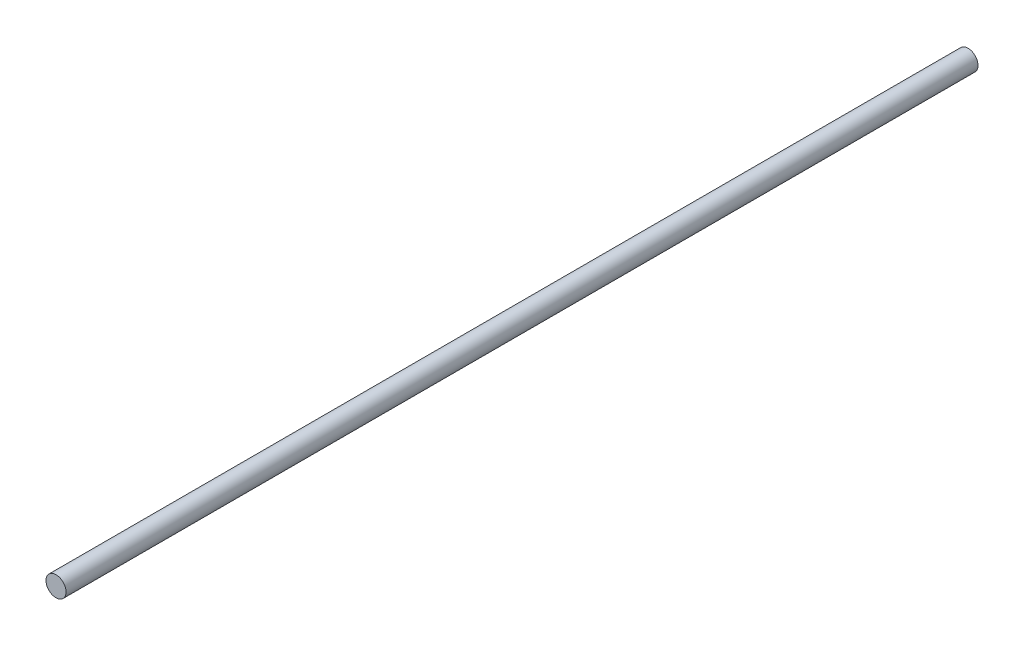
ISO-10303-21;
HEADER;
FILE_DESCRIPTION(('STEP AP214'),'2;1');
FILE_NAME('part.step','',(''),(''),'','','');
FILE_SCHEMA(('AUTOMOTIVE_DESIGN { 1 0 10303 214 1 1 1 1 }'));
ENDSEC;
DATA;
#1=APPLICATION_CONTEXT('core data for automotive mechanical design processes');
#2=APPLICATION_PROTOCOL_DEFINITION('international standard','automotive_design',2000,#1);
#3=PRODUCT_CONTEXT('',#1,'mechanical');
#4=PRODUCT('Part','Part','',(#3));
#5=PRODUCT_RELATED_PRODUCT_CATEGORY('part','',(#4));
#6=PRODUCT_DEFINITION_FORMATION('','',#4);
#7=PRODUCT_DEFINITION_CONTEXT('part definition',#1,'design');
#8=PRODUCT_DEFINITION('design','',#6,#7);
#9=PRODUCT_DEFINITION_SHAPE('','',#8);
#10=(LENGTH_UNIT() NAMED_UNIT(*) SI_UNIT(.MILLI.,.METRE.));
#11=(NAMED_UNIT(*) PLANE_ANGLE_UNIT() SI_UNIT($,.RADIAN.));
#12=(NAMED_UNIT(*) SI_UNIT($,.STERADIAN.) SOLID_ANGLE_UNIT());
#13=UNCERTAINTY_MEASURE_WITH_UNIT(LENGTH_MEASURE(1.E-05),#10,'distance_accuracy_value','');
#14=(GEOMETRIC_REPRESENTATION_CONTEXT(3) GLOBAL_UNCERTAINTY_ASSIGNED_CONTEXT((#13)) GLOBAL_UNIT_ASSIGNED_CONTEXT((#10,
#11,#12)) REPRESENTATION_CONTEXT('',''));
#15=CARTESIAN_POINT('',(0.,0.,0.));
#16=DIRECTION('',(0.,0.,1.));
#17=DIRECTION('',(1.,0.,0.));
#18=AXIS2_PLACEMENT_3D('',#15,#16,#17);
#19=CARTESIAN_POINT('',(0.,0.,273.));
#20=DIRECTION('',(0.,0.,-1.));
#21=DIRECTION('',(-1.,0.,0.));
#22=AXIS2_PLACEMENT_3D('',#19,#20,#21);
#23=CYLINDRICAL_SURFACE('',#22,3.);
#24=CARTESIAN_POINT('',(0.,0.,273.));
#25=DIRECTION('',(0.,0.,1.));
#26=DIRECTION('',(1.,0.,0.));
#27=AXIS2_PLACEMENT_3D('',#24,#25,#26);
#28=CIRCLE('',#27,3.);
#29=CARTESIAN_POINT('',(3.,0.,273.));
#30=VERTEX_POINT('',#29);
#31=EDGE_CURVE('E10',#30,#30,#28,.T.);
#32=ORIENTED_EDGE('',*,*,#31,.F.);
#33=EDGE_LOOP('',(#32));
#34=FACE_BOUND('',#33,.T.);
#35=CARTESIAN_POINT('',(0.,0.,0.));
#36=DIRECTION('',(0.,0.,1.));
#37=DIRECTION('',(1.,0.,0.));
#38=AXIS2_PLACEMENT_3D('',#35,#36,#37);
#39=CIRCLE('',#38,3.);
#40=CARTESIAN_POINT('',(3.,0.,0.));
#41=VERTEX_POINT('',#40);
#42=EDGE_CURVE('E31',#41,#41,#39,.T.);
#43=ORIENTED_EDGE('',*,*,#42,.T.);
#44=EDGE_LOOP('',(#43));
#45=FACE_BOUND('',#44,.T.);
#46=ADVANCED_FACE('F28',(#34,#45),#23,.T.);
#47=CARTESIAN_POINT('',(0.,0.,273.));
#48=DIRECTION('',(0.,0.,1.));
#49=DIRECTION('',(1.,0.,0.));
#50=AXIS2_PLACEMENT_3D('',#47,#48,#49);
#51=PLANE('',#50);
#52=ORIENTED_EDGE('',*,*,#31,.T.);
#53=EDGE_LOOP('',(#52));
#54=FACE_BOUND('',#53,.T.);
#55=ADVANCED_FACE('F43',(#54),#51,.T.);
#56=CARTESIAN_POINT('',(0.,0.,0.));
#57=DIRECTION('',(0.,0.,1.));
#58=DIRECTION('',(1.,0.,0.));
#59=AXIS2_PLACEMENT_3D('',#56,#57,#58);
#60=PLANE('',#59);
#61=ORIENTED_EDGE('',*,*,#42,.F.);
#62=EDGE_LOOP('',(#61));
#63=FACE_BOUND('',#62,.T.);
#64=ADVANCED_FACE('F41',(#63),#60,.F.);
#65=CLOSED_SHELL('',(#46,#55,#64));
#66=MANIFOLD_SOLID_BREP('B2',#65);
#67=ADVANCED_BREP_SHAPE_REPRESENTATION('',(#18,#66),#14);
#68=SHAPE_DEFINITION_REPRESENTATION(#9,#67);
ENDSEC;
END-ISO-10303-21;
